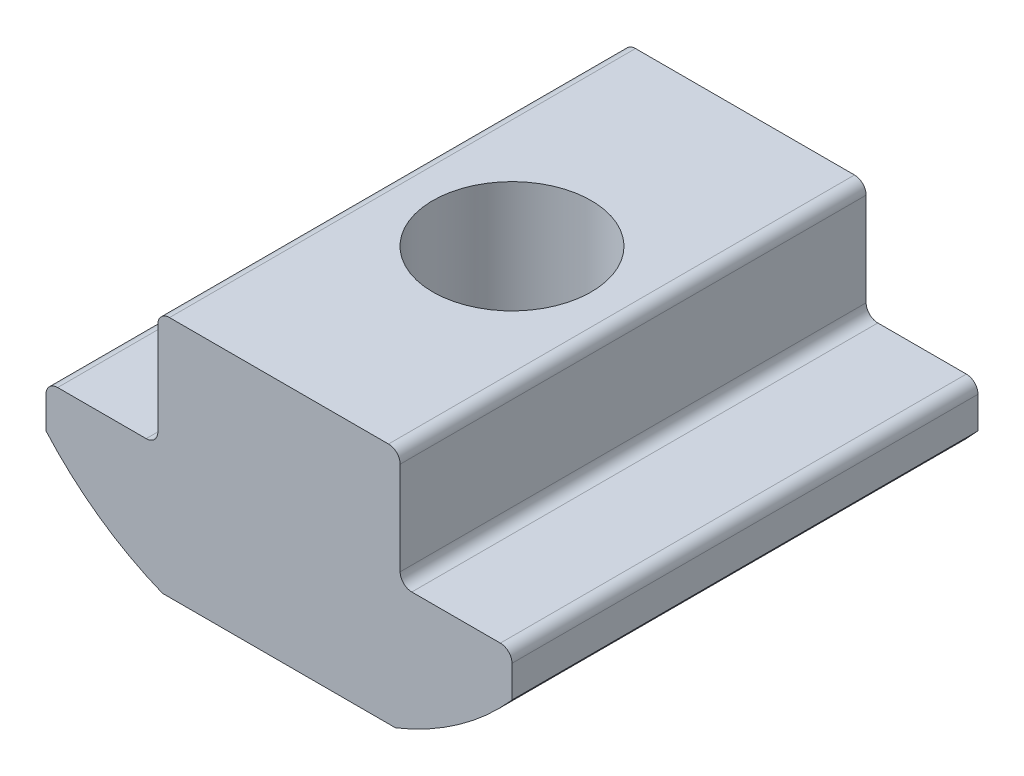
ISO-10303-21;
HEADER;
FILE_DESCRIPTION(('STEP AP214'),'2;1');
FILE_NAME('part.step','',(''),(''),'','','');
FILE_SCHEMA(('AUTOMOTIVE_DESIGN { 1 0 10303 214 1 1 1 1 }'));
ENDSEC;
DATA;
#1=APPLICATION_CONTEXT('core data for automotive mechanical design processes');
#2=APPLICATION_PROTOCOL_DEFINITION('international standard','automotive_design',2000,#1);
#3=PRODUCT_CONTEXT('',#1,'mechanical');
#4=PRODUCT('Part','Part','',(#3));
#5=PRODUCT_RELATED_PRODUCT_CATEGORY('part','',(#4));
#6=PRODUCT_DEFINITION_FORMATION('','',#4);
#7=PRODUCT_DEFINITION_CONTEXT('part definition',#1,'design');
#8=PRODUCT_DEFINITION('design','',#6,#7);
#9=PRODUCT_DEFINITION_SHAPE('','',#8);
#10=(LENGTH_UNIT() NAMED_UNIT(*) SI_UNIT(.MILLI.,.METRE.));
#11=(NAMED_UNIT(*) PLANE_ANGLE_UNIT() SI_UNIT($,.RADIAN.));
#12=(NAMED_UNIT(*) SI_UNIT($,.STERADIAN.) SOLID_ANGLE_UNIT());
#13=UNCERTAINTY_MEASURE_WITH_UNIT(LENGTH_MEASURE(1.E-05),#10,'distance_accuracy_value','');
#14=(GEOMETRIC_REPRESENTATION_CONTEXT(3) GLOBAL_UNCERTAINTY_ASSIGNED_CONTEXT((#13)) GLOBAL_UNIT_ASSIGNED_CONTEXT((#10,
#11,#12)) REPRESENTATION_CONTEXT('',''));
#15=CARTESIAN_POINT('',(0.,0.,0.));
#16=DIRECTION('',(0.,0.,1.));
#17=DIRECTION('',(1.,0.,0.));
#18=AXIS2_PLACEMENT_3D('',#15,#16,#17);
#19=CARTESIAN_POINT('',(-0.0580530387624094,12.2889853988804,10.));
#20=DIRECTION('',(0.,0.,-1.));
#21=DIRECTION('',(-1.,0.,0.));
#22=AXIS2_PLACEMENT_3D('',#19,#20,#21);
#23=CYLINDRICAL_SURFACE('',#22,13.2454521214485);
#24=CARTESIAN_POINT('',(-0.0580530387624094,12.2889853988804,-10.));
#25=DIRECTION('',(0.,0.,1.));
#26=DIRECTION('',(1.,0.,0.));
#27=AXIS2_PLACEMENT_3D('',#24,#25,#26);
#28=CIRCLE('',#27,13.2454521214485);
#29=CARTESIAN_POINT('',(-10.0000000000005,3.53686036997942,-10.));
#30=VERTEX_POINT('',#29);
#31=CARTESIAN_POINT('',(-5.,0.,-10.));
#32=VERTEX_POINT('',#31);
#33=EDGE_CURVE('E183',#30,#32,#28,.T.);
#34=ORIENTED_EDGE('',*,*,#33,.T.);
#35=DIRECTION('',(0.,0.,-1.));
#36=VECTOR('',#35,1.);
#37=CARTESIAN_POINT('',(-5.,0.,10.));
#38=LINE('',#37,#36);
#39=CARTESIAN_POINT('',(-5.,0.,10.));
#40=VERTEX_POINT('',#39);
#41=EDGE_CURVE('E11',#40,#32,#38,.T.);
#42=ORIENTED_EDGE('',*,*,#41,.F.);
#43=CARTESIAN_POINT('',(-0.0580530387624094,12.2889853988804,10.));
#44=DIRECTION('',(0.,0.,1.));
#45=DIRECTION('',(1.,0.,0.));
#46=AXIS2_PLACEMENT_3D('',#43,#44,#45);
#47=CIRCLE('',#46,13.2454521214485);
#48=CARTESIAN_POINT('',(-10.0000000000005,3.53686036997942,10.));
#49=VERTEX_POINT('',#48);
#50=EDGE_CURVE('E214',#49,#40,#47,.T.);
#51=ORIENTED_EDGE('',*,*,#50,.F.);
#52=DIRECTION('',(0.,0.,-1.));
#53=VECTOR('',#52,1.);
#54=CARTESIAN_POINT('',(-10.0000000000005,3.53686036997942,10.));
#55=LINE('',#54,#53);
#56=EDGE_CURVE('E179',#49,#30,#55,.T.);
#57=ORIENTED_EDGE('',*,*,#56,.T.);
#58=EDGE_LOOP('',(#34,#42,#51,#57));
#59=FACE_BOUND('',#58,.T.);
#60=ADVANCED_FACE('F39',(#59),#23,.T.);
#61=CARTESIAN_POINT('',(-5.,0.,10.));
#62=DIRECTION('',(0.,1.,0.));
#63=DIRECTION('',(0.,0.,1.));
#64=AXIS2_PLACEMENT_3D('',#61,#62,#63);
#65=PLANE('',#64);
#66=CARTESIAN_POINT('',(0.,0.,0.));
#67=DIRECTION('',(0.,1.,0.));
#68=DIRECTION('',(0.,0.,1.));
#69=AXIS2_PLACEMENT_3D('',#66,#67,#68);
#70=CIRCLE('',#69,3.39999999999999);
#71=CARTESIAN_POINT('',(0.,0.,3.39999999999999));
#72=VERTEX_POINT('',#71);
#73=EDGE_CURVE('E187',#72,#72,#70,.T.);
#74=ORIENTED_EDGE('',*,*,#73,.T.);
#75=EDGE_LOOP('',(#74));
#76=FACE_BOUND('',#75,.T.);
#77=DIRECTION('',(1.,0.,0.));
#78=VECTOR('',#77,1.);
#79=CARTESIAN_POINT('',(-5.,0.,-10.));
#80=LINE('',#79,#78);
#81=CARTESIAN_POINT('',(5.,0.,-10.));
#82=VERTEX_POINT('',#81);
#83=EDGE_CURVE('E186',#32,#82,#80,.T.);
#84=ORIENTED_EDGE('',*,*,#83,.T.);
#85=DIRECTION('',(0.,0.,-1.));
#86=VECTOR('',#85,1.);
#87=CARTESIAN_POINT('',(5.,0.,10.));
#88=LINE('',#87,#86);
#89=CARTESIAN_POINT('',(5.,0.,10.));
#90=VERTEX_POINT('',#89);
#91=EDGE_CURVE('E47',#90,#82,#88,.T.);
#92=ORIENTED_EDGE('',*,*,#91,.F.);
#93=DIRECTION('',(1.,0.,0.));
#94=VECTOR('',#93,1.);
#95=CARTESIAN_POINT('',(-5.,0.,10.));
#96=LINE('',#95,#94);
#97=EDGE_CURVE('E122',#40,#90,#96,.T.);
#98=ORIENTED_EDGE('',*,*,#97,.F.);
#99=ORIENTED_EDGE('',*,*,#41,.T.);
#100=EDGE_LOOP('',(#84,#92,#98,#99));
#101=FACE_BOUND('',#100,.T.);
#102=ADVANCED_FACE('F312',(#76,#101),#65,.F.);
#103=CARTESIAN_POINT('',(0.0580530387624094,12.2889853988804,10.));
#104=DIRECTION('',(0.,0.,-1.));
#105=DIRECTION('',(-1.,0.,0.));
#106=AXIS2_PLACEMENT_3D('',#103,#104,#105);
#107=CYLINDRICAL_SURFACE('',#106,13.2454521214484);
#108=CARTESIAN_POINT('',(0.0580530387624094,12.2889853988804,-10.));
#109=DIRECTION('',(0.,0.,1.));
#110=DIRECTION('',(1.,0.,0.));
#111=AXIS2_PLACEMENT_3D('',#108,#109,#110);
#112=CIRCLE('',#111,13.2454521214484);
#113=CARTESIAN_POINT('',(9.99999999999995,3.536860369979,-10.));
#114=VERTEX_POINT('',#113);
#115=EDGE_CURVE('E189',#82,#114,#112,.T.);
#116=ORIENTED_EDGE('',*,*,#115,.T.);
#117=DIRECTION('',(0.,0.,-1.));
#118=VECTOR('',#117,1.);
#119=CARTESIAN_POINT('',(9.99999999999995,3.536860369979,10.));
#120=LINE('',#119,#118);
#121=CARTESIAN_POINT('',(9.99999999999995,3.536860369979,10.));
#122=VERTEX_POINT('',#121);
#123=EDGE_CURVE('E245',#122,#114,#120,.T.);
#124=ORIENTED_EDGE('',*,*,#123,.F.);
#125=CARTESIAN_POINT('',(0.0580530387624094,12.2889853988804,10.));
#126=DIRECTION('',(0.,0.,1.));
#127=DIRECTION('',(1.,0.,0.));
#128=AXIS2_PLACEMENT_3D('',#125,#126,#127);
#129=CIRCLE('',#128,13.2454521214484);
#130=EDGE_CURVE('E253',#90,#122,#129,.T.);
#131=ORIENTED_EDGE('',*,*,#130,.F.);
#132=ORIENTED_EDGE('',*,*,#91,.T.);
#133=EDGE_LOOP('',(#116,#124,#131,#132));
#134=FACE_BOUND('',#133,.T.);
#135=ADVANCED_FACE('F251',(#134),#107,.T.);
#136=CARTESIAN_POINT('',(10.,4.90000000000009,10.));
#137=DIRECTION('',(-1.,0.,0.));
#138=DIRECTION('',(0.,0.,1.));
#139=AXIS2_PLACEMENT_3D('',#136,#137,#138);
#140=PLANE('',#139);
#141=DIRECTION('',(0.,1.,0.));
#142=VECTOR('',#141,1.);
#143=CARTESIAN_POINT('',(10.,4.90000000000009,-10.));
#144=LINE('',#143,#142);
#145=CARTESIAN_POINT('',(10.,4.90000000000009,-10.));
#146=VERTEX_POINT('',#145);
#147=EDGE_CURVE('E191',#114,#146,#144,.T.);
#148=ORIENTED_EDGE('',*,*,#147,.T.);
#149=DIRECTION('',(0.,0.,-1.));
#150=VECTOR('',#149,1.);
#151=CARTESIAN_POINT('',(10.,4.90000000000009,10.));
#152=LINE('',#151,#150);
#153=CARTESIAN_POINT('',(10.,4.90000000000009,10.));
#154=VERTEX_POINT('',#153);
#155=EDGE_CURVE('E242',#154,#146,#152,.T.);
#156=ORIENTED_EDGE('',*,*,#155,.F.);
#157=DIRECTION('',(0.,1.,0.));
#158=VECTOR('',#157,1.);
#159=CARTESIAN_POINT('',(10.,4.90000000000009,10.));
#160=LINE('',#159,#158);
#161=EDGE_CURVE('E271',#122,#154,#160,.T.);
#162=ORIENTED_EDGE('',*,*,#161,.F.);
#163=ORIENTED_EDGE('',*,*,#123,.T.);
#164=EDGE_LOOP('',(#148,#156,#162,#163));
#165=FACE_BOUND('',#164,.T.);
#166=ADVANCED_FACE('F262',(#165),#140,.F.);
#167=CARTESIAN_POINT('',(9.5,4.90000000000009,10.));
#168=DIRECTION('',(0.,0.,-1.));
#169=DIRECTION('',(-1.,0.,0.));
#170=AXIS2_PLACEMENT_3D('',#167,#168,#169);
#171=CYLINDRICAL_SURFACE('',#170,0.5);
#172=CARTESIAN_POINT('',(9.5,4.90000000000009,-10.));
#173=DIRECTION('',(0.,0.,1.));
#174=DIRECTION('',(1.,0.,0.));
#175=AXIS2_PLACEMENT_3D('',#172,#173,#174);
#176=CIRCLE('',#175,0.5);
#177=CARTESIAN_POINT('',(9.5,5.40000000000009,-10.));
#178=VERTEX_POINT('',#177);
#179=EDGE_CURVE('E193',#146,#178,#176,.T.);
#180=ORIENTED_EDGE('',*,*,#179,.T.);
#181=DIRECTION('',(0.,0.,-1.));
#182=VECTOR('',#181,1.);
#183=CARTESIAN_POINT('',(9.5,5.40000000000009,10.));
#184=LINE('',#183,#182);
#185=CARTESIAN_POINT('',(9.5,5.40000000000009,10.));
#186=VERTEX_POINT('',#185);
#187=EDGE_CURVE('E239',#186,#178,#184,.T.);
#188=ORIENTED_EDGE('',*,*,#187,.F.);
#189=CARTESIAN_POINT('',(9.5,4.90000000000009,10.));
#190=DIRECTION('',(0.,0.,1.));
#191=DIRECTION('',(1.,0.,0.));
#192=AXIS2_PLACEMENT_3D('',#189,#190,#191);
#193=CIRCLE('',#192,0.5);
#194=EDGE_CURVE('E268',#154,#186,#193,.T.);
#195=ORIENTED_EDGE('',*,*,#194,.F.);
#196=ORIENTED_EDGE('',*,*,#155,.T.);
#197=EDGE_LOOP('',(#180,#188,#195,#196));
#198=FACE_BOUND('',#197,.T.);
#199=ADVANCED_FACE('F266',(#198),#171,.T.);
#200=CARTESIAN_POINT('',(5.69999999999982,5.40000000000009,10.));
#201=DIRECTION('',(0.,-1.,0.));
#202=DIRECTION('',(0.,0.,-1.));
#203=AXIS2_PLACEMENT_3D('',#200,#201,#202);
#204=PLANE('',#203);
#205=DIRECTION('',(-1.,0.,0.));
#206=VECTOR('',#205,1.);
#207=CARTESIAN_POINT('',(5.69999999999982,5.40000000000009,-10.));
#208=LINE('',#207,#206);
#209=CARTESIAN_POINT('',(5.69999999999982,5.40000000000009,-10.));
#210=VERTEX_POINT('',#209);
#211=EDGE_CURVE('E195',#178,#210,#208,.T.);
#212=ORIENTED_EDGE('',*,*,#211,.T.);
#213=DIRECTION('',(0.,0.,-1.));
#214=VECTOR('',#213,1.);
#215=CARTESIAN_POINT('',(5.69999999999982,5.40000000000009,10.));
#216=LINE('',#215,#214);
#217=CARTESIAN_POINT('',(5.69999999999982,5.40000000000009,10.));
#218=VERTEX_POINT('',#217);
#219=EDGE_CURVE('E236',#218,#210,#216,.T.);
#220=ORIENTED_EDGE('',*,*,#219,.F.);
#221=DIRECTION('',(-1.,0.,0.));
#222=VECTOR('',#221,1.);
#223=CARTESIAN_POINT('',(5.69999999999982,5.40000000000009,10.));
#224=LINE('',#223,#222);
#225=EDGE_CURVE('E270',#186,#218,#224,.T.);
#226=ORIENTED_EDGE('',*,*,#225,.F.);
#227=ORIENTED_EDGE('',*,*,#187,.T.);
#228=EDGE_LOOP('',(#212,#220,#226,#227));
#229=FACE_BOUND('',#228,.T.);
#230=ADVANCED_FACE('F327',(#229),#204,.F.);
#231=CARTESIAN_POINT('',(5.69999999999982,5.90000000000009,10.));
#232=DIRECTION('',(0.,0.,-1.));
#233=DIRECTION('',(-1.,0.,0.));
#234=AXIS2_PLACEMENT_3D('',#231,#232,#233);
#235=CYLINDRICAL_SURFACE('',#234,0.5);
#236=CARTESIAN_POINT('',(5.69999999999982,5.90000000000009,-10.));
#237=DIRECTION('',(0.,0.,-1.));
#238=DIRECTION('',(1.,0.,0.));
#239=AXIS2_PLACEMENT_3D('',#236,#237,#238);
#240=CIRCLE('',#239,0.5);
#241=CARTESIAN_POINT('',(5.19999999999982,5.90000000000009,-10.));
#242=VERTEX_POINT('',#241);
#243=EDGE_CURVE('E197',#210,#242,#240,.T.);
#244=ORIENTED_EDGE('',*,*,#243,.T.);
#245=DIRECTION('',(0.,0.,-1.));
#246=VECTOR('',#245,1.);
#247=CARTESIAN_POINT('',(5.19999999999982,5.90000000000009,10.));
#248=LINE('',#247,#246);
#249=CARTESIAN_POINT('',(5.19999999999982,5.90000000000009,10.));
#250=VERTEX_POINT('',#249);
#251=EDGE_CURVE('E233',#250,#242,#248,.T.);
#252=ORIENTED_EDGE('',*,*,#251,.F.);
#253=CARTESIAN_POINT('',(5.69999999999982,5.90000000000009,10.));
#254=DIRECTION('',(0.,0.,-1.));
#255=DIRECTION('',(1.,0.,0.));
#256=AXIS2_PLACEMENT_3D('',#253,#254,#255);
#257=CIRCLE('',#256,0.5);
#258=EDGE_CURVE('E273',#218,#250,#257,.T.);
#259=ORIENTED_EDGE('',*,*,#258,.F.);
#260=ORIENTED_EDGE('',*,*,#219,.T.);
#261=EDGE_LOOP('',(#244,#252,#259,#260));
#262=FACE_BOUND('',#261,.T.);
#263=ADVANCED_FACE('F330',(#262),#235,.F.);
#264=CARTESIAN_POINT('',(5.20000000000027,9.90000000000009,10.));
#265=DIRECTION('',(-1.,1.13624387676481E-13,0.));
#266=DIRECTION('',(-1.13624387676481E-13,-1.,0.));
#267=AXIS2_PLACEMENT_3D('',#264,#265,#266);
#268=PLANE('',#267);
#269=DIRECTION('',(1.13624387676481E-13,1.,0.));
#270=VECTOR('',#269,1.);
#271=CARTESIAN_POINT('',(5.20000000000027,9.90000000000009,-10.));
#272=LINE('',#271,#270);
#273=CARTESIAN_POINT('',(5.20000000000027,9.90000000000009,-10.));
#274=VERTEX_POINT('',#273);
#275=EDGE_CURVE('E199',#242,#274,#272,.T.);
#276=ORIENTED_EDGE('',*,*,#275,.T.);
#277=DIRECTION('',(0.,0.,-1.));
#278=VECTOR('',#277,1.);
#279=CARTESIAN_POINT('',(5.20000000000027,9.90000000000009,10.));
#280=LINE('',#279,#278);
#281=CARTESIAN_POINT('',(5.20000000000027,9.90000000000009,10.));
#282=VERTEX_POINT('',#281);
#283=EDGE_CURVE('E230',#282,#274,#280,.T.);
#284=ORIENTED_EDGE('',*,*,#283,.F.);
#285=DIRECTION('',(1.13624387676481E-13,1.,0.));
#286=VECTOR('',#285,1.);
#287=CARTESIAN_POINT('',(5.20000000000027,9.90000000000009,10.));
#288=LINE('',#287,#286);
#289=EDGE_CURVE('E279',#250,#282,#288,.T.);
#290=ORIENTED_EDGE('',*,*,#289,.F.);
#291=ORIENTED_EDGE('',*,*,#251,.T.);
#292=EDGE_LOOP('',(#276,#284,#290,#291));
#293=FACE_BOUND('',#292,.T.);
#294=ADVANCED_FACE('F334',(#293),#268,.F.);
#295=CARTESIAN_POINT('',(4.70000000000027,9.90000000000009,10.));
#296=DIRECTION('',(0.,0.,-1.));
#297=DIRECTION('',(-1.,0.,0.));
#298=AXIS2_PLACEMENT_3D('',#295,#296,#297);
#299=CYLINDRICAL_SURFACE('',#298,0.5);
#300=CARTESIAN_POINT('',(4.70000000000027,9.90000000000009,-10.));
#301=DIRECTION('',(0.,0.,1.));
#302=DIRECTION('',(1.,0.,0.));
#303=AXIS2_PLACEMENT_3D('',#300,#301,#302);
#304=CIRCLE('',#303,0.5);
#305=CARTESIAN_POINT('',(4.70000000000027,10.4000000000001,-10.));
#306=VERTEX_POINT('',#305);
#307=EDGE_CURVE('E201',#274,#306,#304,.T.);
#308=ORIENTED_EDGE('',*,*,#307,.T.);
#309=DIRECTION('',(0.,0.,-1.));
#310=VECTOR('',#309,1.);
#311=CARTESIAN_POINT('',(4.70000000000027,10.4000000000001,10.));
#312=LINE('',#311,#310);
#313=CARTESIAN_POINT('',(4.70000000000027,10.4000000000001,10.));
#314=VERTEX_POINT('',#313);
#315=EDGE_CURVE('E227',#314,#306,#312,.T.);
#316=ORIENTED_EDGE('',*,*,#315,.F.);
#317=CARTESIAN_POINT('',(4.70000000000027,9.90000000000009,10.));
#318=DIRECTION('',(0.,0.,1.));
#319=DIRECTION('',(1.,0.,0.));
#320=AXIS2_PLACEMENT_3D('',#317,#318,#319);
#321=CIRCLE('',#320,0.5);
#322=EDGE_CURVE('E281',#282,#314,#321,.T.);
#323=ORIENTED_EDGE('',*,*,#322,.F.);
#324=ORIENTED_EDGE('',*,*,#283,.T.);
#325=EDGE_LOOP('',(#308,#316,#323,#324));
#326=FACE_BOUND('',#325,.T.);
#327=ADVANCED_FACE('F338',(#326),#299,.T.);
#328=CARTESIAN_POINT('',(-4.69999999999982,10.4000000000001,10.));
#329=DIRECTION('',(0.,-1.,0.));
#330=DIRECTION('',(0.,0.,-1.));
#331=AXIS2_PLACEMENT_3D('',#328,#329,#330);
#332=PLANE('',#331);
#333=CARTESIAN_POINT('',(0.,10.4000000000001,0.));
#334=DIRECTION('',(0.,1.,0.));
#335=DIRECTION('',(0.,0.,1.));
#336=AXIS2_PLACEMENT_3D('',#333,#334,#335);
#337=CIRCLE('',#336,3.39999999999999);
#338=CARTESIAN_POINT('',(0.,10.4000000000001,3.39999999999999));
#339=VERTEX_POINT('',#338);
#340=EDGE_CURVE('E414',#339,#339,#337,.T.);
#341=ORIENTED_EDGE('',*,*,#340,.F.);
#342=EDGE_LOOP('',(#341));
#343=FACE_BOUND('',#342,.T.);
#344=DIRECTION('',(-1.,0.,0.));
#345=VECTOR('',#344,1.);
#346=CARTESIAN_POINT('',(-4.69999999999982,10.4000000000001,-10.));
#347=LINE('',#346,#345);
#348=CARTESIAN_POINT('',(-4.69999999999982,10.4000000000001,-10.));
#349=VERTEX_POINT('',#348);
#350=EDGE_CURVE('E203',#306,#349,#347,.T.);
#351=ORIENTED_EDGE('',*,*,#350,.T.);
#352=DIRECTION('',(0.,0.,-1.));
#353=VECTOR('',#352,1.);
#354=CARTESIAN_POINT('',(-4.69999999999982,10.4000000000001,10.));
#355=LINE('',#354,#353);
#356=CARTESIAN_POINT('',(-4.69999999999982,10.4000000000001,10.));
#357=VERTEX_POINT('',#356);
#358=EDGE_CURVE('E224',#357,#349,#355,.T.);
#359=ORIENTED_EDGE('',*,*,#358,.F.);
#360=DIRECTION('',(-1.,0.,0.));
#361=VECTOR('',#360,1.);
#362=CARTESIAN_POINT('',(-4.69999999999982,10.4000000000001,10.));
#363=LINE('',#362,#361);
#364=EDGE_CURVE('E283',#314,#357,#363,.T.);
#365=ORIENTED_EDGE('',*,*,#364,.F.);
#366=ORIENTED_EDGE('',*,*,#315,.T.);
#367=EDGE_LOOP('',(#351,#359,#365,#366));
#368=FACE_BOUND('',#367,.T.);
#369=ADVANCED_FACE('F342',(#343,#368),#332,.F.);
#370=CARTESIAN_POINT('',(-4.70000000000027,9.90000000000009,10.));
#371=DIRECTION('',(0.,0.,-1.));
#372=DIRECTION('',(-1.,0.,0.));
#373=AXIS2_PLACEMENT_3D('',#370,#371,#372);
#374=CYLINDRICAL_SURFACE('',#373,0.499999999999773);
#375=CARTESIAN_POINT('',(-4.70000000000027,9.90000000000009,-10.));
#376=DIRECTION('',(0.,0.,1.));
#377=DIRECTION('',(1.,0.,0.));
#378=AXIS2_PLACEMENT_3D('',#375,#376,#377);
#379=CIRCLE('',#378,0.499999999999773);
#380=CARTESIAN_POINT('',(-5.20000000000005,9.90000000000009,-10.));
#381=VERTEX_POINT('',#380);
#382=EDGE_CURVE('E205',#349,#381,#379,.T.);
#383=ORIENTED_EDGE('',*,*,#382,.T.);
#384=DIRECTION('',(0.,0.,-1.));
#385=VECTOR('',#384,1.);
#386=CARTESIAN_POINT('',(-5.20000000000005,9.90000000000009,10.));
#387=LINE('',#386,#385);
#388=CARTESIAN_POINT('',(-5.20000000000005,9.90000000000009,10.));
#389=VERTEX_POINT('',#388);
#390=EDGE_CURVE('E221',#389,#381,#387,.T.);
#391=ORIENTED_EDGE('',*,*,#390,.F.);
#392=CARTESIAN_POINT('',(-4.70000000000027,9.90000000000009,10.));
#393=DIRECTION('',(0.,0.,1.));
#394=DIRECTION('',(1.,0.,0.));
#395=AXIS2_PLACEMENT_3D('',#392,#393,#394);
#396=CIRCLE('',#395,0.499999999999773);
#397=EDGE_CURVE('E285',#357,#389,#396,.T.);
#398=ORIENTED_EDGE('',*,*,#397,.F.);
#399=ORIENTED_EDGE('',*,*,#358,.T.);
#400=EDGE_LOOP('',(#383,#391,#398,#399));
#401=FACE_BOUND('',#400,.T.);
#402=ADVANCED_FACE('F346',(#401),#374,.T.);
#403=CARTESIAN_POINT('',(-5.19999999999982,9.90000000000009,10.));
#404=DIRECTION('',(1.,0.,0.));
#405=DIRECTION('',(0.,0.,-1.));
#406=AXIS2_PLACEMENT_3D('',#403,#404,#405);
#407=PLANE('',#406);
#408=DIRECTION('',(0.,-1.,0.));
#409=VECTOR('',#408,1.);
#410=CARTESIAN_POINT('',(-5.19999999999982,9.90000000000009,-10.));
#411=LINE('',#410,#409);
#412=CARTESIAN_POINT('',(-5.19999999999982,5.90000000000009,-10.));
#413=VERTEX_POINT('',#412);
#414=EDGE_CURVE('E207',#381,#413,#411,.T.);
#415=ORIENTED_EDGE('',*,*,#414,.T.);
#416=DIRECTION('',(0.,0.,-1.));
#417=VECTOR('',#416,1.);
#418=CARTESIAN_POINT('',(-5.19999999999982,5.90000000000009,10.));
#419=LINE('',#418,#417);
#420=CARTESIAN_POINT('',(-5.19999999999982,5.90000000000009,10.));
#421=VERTEX_POINT('',#420);
#422=EDGE_CURVE('E218',#421,#413,#419,.T.);
#423=ORIENTED_EDGE('',*,*,#422,.F.);
#424=DIRECTION('',(0.,-1.,0.));
#425=VECTOR('',#424,1.);
#426=CARTESIAN_POINT('',(-5.19999999999982,9.90000000000009,10.));
#427=LINE('',#426,#425);
#428=EDGE_CURVE('E287',#389,#421,#427,.T.);
#429=ORIENTED_EDGE('',*,*,#428,.F.);
#430=ORIENTED_EDGE('',*,*,#390,.T.);
#431=EDGE_LOOP('',(#415,#423,#429,#430));
#432=FACE_BOUND('',#431,.T.);
#433=ADVANCED_FACE('F293',(#432),#407,.F.);
#434=CARTESIAN_POINT('',(-5.69999999999982,5.90000000000009,10.));
#435=DIRECTION('',(0.,0.,-1.));
#436=DIRECTION('',(-1.,0.,0.));
#437=AXIS2_PLACEMENT_3D('',#434,#435,#436);
#438=CYLINDRICAL_SURFACE('',#437,0.5);
#439=CARTESIAN_POINT('',(-5.69999999999982,5.90000000000009,-10.));
#440=DIRECTION('',(0.,0.,-1.));
#441=DIRECTION('',(1.,0.,0.));
#442=AXIS2_PLACEMENT_3D('',#439,#440,#441);
#443=CIRCLE('',#442,0.5);
#444=CARTESIAN_POINT('',(-5.69999999999982,5.40000000000009,-10.));
#445=VERTEX_POINT('',#444);
#446=EDGE_CURVE('E209',#413,#445,#443,.T.);
#447=ORIENTED_EDGE('',*,*,#446,.T.);
#448=DIRECTION('',(0.,0.,-1.));
#449=VECTOR('',#448,1.);
#450=CARTESIAN_POINT('',(-5.69999999999982,5.40000000000009,10.));
#451=LINE('',#450,#449);
#452=CARTESIAN_POINT('',(-5.69999999999982,5.40000000000009,10.));
#453=VERTEX_POINT('',#452);
#454=EDGE_CURVE('E174',#453,#445,#451,.T.);
#455=ORIENTED_EDGE('',*,*,#454,.F.);
#456=CARTESIAN_POINT('',(-5.69999999999982,5.90000000000009,10.));
#457=DIRECTION('',(0.,0.,-1.));
#458=DIRECTION('',(1.,0.,0.));
#459=AXIS2_PLACEMENT_3D('',#456,#457,#458);
#460=CIRCLE('',#459,0.5);
#461=EDGE_CURVE('E165',#421,#453,#460,.T.);
#462=ORIENTED_EDGE('',*,*,#461,.F.);
#463=ORIENTED_EDGE('',*,*,#422,.T.);
#464=EDGE_LOOP('',(#447,#455,#462,#463));
#465=FACE_BOUND('',#464,.T.);
#466=ADVANCED_FACE('F297',(#465),#438,.F.);
#467=CARTESIAN_POINT('',(-9.5,5.40000000000009,10.));
#468=DIRECTION('',(0.,-1.,0.));
#469=DIRECTION('',(0.,0.,-1.));
#470=AXIS2_PLACEMENT_3D('',#467,#468,#469);
#471=PLANE('',#470);
#472=DIRECTION('',(-1.,0.,0.));
#473=VECTOR('',#472,1.);
#474=CARTESIAN_POINT('',(-9.5,5.40000000000009,-10.));
#475=LINE('',#474,#473);
#476=CARTESIAN_POINT('',(-9.5,5.40000000000009,-10.));
#477=VERTEX_POINT('',#476);
#478=EDGE_CURVE('E173',#445,#477,#475,.T.);
#479=ORIENTED_EDGE('',*,*,#478,.T.);
#480=DIRECTION('',(0.,0.,-1.));
#481=VECTOR('',#480,1.);
#482=CARTESIAN_POINT('',(-9.5,5.40000000000009,10.));
#483=LINE('',#482,#481);
#484=CARTESIAN_POINT('',(-9.5,5.40000000000009,10.));
#485=VERTEX_POINT('',#484);
#486=EDGE_CURVE('E170',#485,#477,#483,.T.);
#487=ORIENTED_EDGE('',*,*,#486,.F.);
#488=DIRECTION('',(-1.,0.,0.));
#489=VECTOR('',#488,1.);
#490=CARTESIAN_POINT('',(-9.5,5.40000000000009,10.));
#491=LINE('',#490,#489);
#492=EDGE_CURVE('E159',#453,#485,#491,.T.);
#493=ORIENTED_EDGE('',*,*,#492,.F.);
#494=ORIENTED_EDGE('',*,*,#454,.T.);
#495=EDGE_LOOP('',(#479,#487,#493,#494));
#496=FACE_BOUND('',#495,.T.);
#497=ADVANCED_FACE('F171',(#496),#471,.F.);
#498=CARTESIAN_POINT('',(-9.50000000000045,4.90000000000009,10.));
#499=DIRECTION('',(0.,0.,-1.));
#500=DIRECTION('',(-1.,0.,0.));
#501=AXIS2_PLACEMENT_3D('',#498,#499,#500);
#502=CYLINDRICAL_SURFACE('',#501,0.499999999999773);
#503=CARTESIAN_POINT('',(-9.50000000000045,4.90000000000009,-10.));
#504=DIRECTION('',(0.,0.,1.));
#505=DIRECTION('',(1.,0.,0.));
#506=AXIS2_PLACEMENT_3D('',#503,#504,#505);
#507=CIRCLE('',#506,0.499999999999773);
#508=CARTESIAN_POINT('',(-10.0000000000002,4.90000000000009,-10.));
#509=VERTEX_POINT('',#508);
#510=EDGE_CURVE('E108',#477,#509,#507,.T.);
#511=ORIENTED_EDGE('',*,*,#510,.T.);
#512=DIRECTION('',(0.,0.,-1.));
#513=VECTOR('',#512,1.);
#514=CARTESIAN_POINT('',(-10.0000000000002,4.90000000000009,10.));
#515=LINE('',#514,#513);
#516=CARTESIAN_POINT('',(-10.0000000000002,4.90000000000009,10.));
#517=VERTEX_POINT('',#516);
#518=EDGE_CURVE('E175',#517,#509,#515,.T.);
#519=ORIENTED_EDGE('',*,*,#518,.F.);
#520=CARTESIAN_POINT('',(-9.50000000000045,4.90000000000009,10.));
#521=DIRECTION('',(0.,0.,1.));
#522=DIRECTION('',(1.,0.,0.));
#523=AXIS2_PLACEMENT_3D('',#520,#521,#522);
#524=CIRCLE('',#523,0.499999999999773);
#525=EDGE_CURVE('E163',#485,#517,#524,.T.);
#526=ORIENTED_EDGE('',*,*,#525,.F.);
#527=ORIENTED_EDGE('',*,*,#486,.T.);
#528=EDGE_LOOP('',(#511,#519,#526,#527));
#529=FACE_BOUND('',#528,.T.);
#530=ADVANCED_FACE('F177',(#529),#502,.T.);
#531=CARTESIAN_POINT('',(-10.,4.90000000000009,10.));
#532=DIRECTION('',(1.,-3.33419659069726E-13,0.));
#533=DIRECTION('',(3.33419659069726E-13,1.,0.));
#534=AXIS2_PLACEMENT_3D('',#531,#532,#533);
#535=PLANE('',#534);
#536=DIRECTION('',(-3.33419659069726E-13,-1.,0.));
#537=VECTOR('',#536,1.);
#538=CARTESIAN_POINT('',(-10.,4.90000000000009,-10.));
#539=LINE('',#538,#537);
#540=EDGE_CURVE('E114',#509,#30,#539,.T.);
#541=ORIENTED_EDGE('',*,*,#540,.T.);
#542=ORIENTED_EDGE('',*,*,#56,.F.);
#543=DIRECTION('',(-3.33419659069726E-13,-1.,0.));
#544=VECTOR('',#543,1.);
#545=CARTESIAN_POINT('',(-10.,4.90000000000009,10.));
#546=LINE('',#545,#544);
#547=EDGE_CURVE('E55',#517,#49,#546,.T.);
#548=ORIENTED_EDGE('',*,*,#547,.F.);
#549=ORIENTED_EDGE('',*,*,#518,.T.);
#550=EDGE_LOOP('',(#541,#542,#548,#549));
#551=FACE_BOUND('',#550,.T.);
#552=ADVANCED_FACE('F301',(#551),#535,.F.);
#553=CARTESIAN_POINT('',(-0.0580530387624094,12.2889853988804,10.));
#554=DIRECTION('',(0.,0.,1.));
#555=DIRECTION('',(1.,0.,0.));
#556=AXIS2_PLACEMENT_3D('',#553,#554,#555);
#557=PLANE('',#556);
#558=ORIENTED_EDGE('',*,*,#50,.T.);
#559=ORIENTED_EDGE('',*,*,#97,.T.);
#560=ORIENTED_EDGE('',*,*,#130,.T.);
#561=ORIENTED_EDGE('',*,*,#161,.T.);
#562=ORIENTED_EDGE('',*,*,#194,.T.);
#563=ORIENTED_EDGE('',*,*,#225,.T.);
#564=ORIENTED_EDGE('',*,*,#258,.T.);
#565=ORIENTED_EDGE('',*,*,#289,.T.);
#566=ORIENTED_EDGE('',*,*,#322,.T.);
#567=ORIENTED_EDGE('',*,*,#364,.T.);
#568=ORIENTED_EDGE('',*,*,#397,.T.);
#569=ORIENTED_EDGE('',*,*,#428,.T.);
#570=ORIENTED_EDGE('',*,*,#461,.T.);
#571=ORIENTED_EDGE('',*,*,#492,.T.);
#572=ORIENTED_EDGE('',*,*,#525,.T.);
#573=ORIENTED_EDGE('',*,*,#547,.T.);
#574=EDGE_LOOP('',(#558,#559,#560,#561,#562,#563,#564,#565,#566,#567,#568,#569,#570,#571,#572,#573));
#575=FACE_BOUND('',#574,.T.);
#576=ADVANCED_FACE('F161',(#575),#557,.T.);
#577=CARTESIAN_POINT('',(-0.0580530387624094,12.2889853988804,-10.));
#578=DIRECTION('',(0.,0.,1.));
#579=DIRECTION('',(1.,0.,0.));
#580=AXIS2_PLACEMENT_3D('',#577,#578,#579);
#581=PLANE('',#580);
#582=ORIENTED_EDGE('',*,*,#33,.F.);
#583=ORIENTED_EDGE('',*,*,#540,.F.);
#584=ORIENTED_EDGE('',*,*,#510,.F.);
#585=ORIENTED_EDGE('',*,*,#478,.F.);
#586=ORIENTED_EDGE('',*,*,#446,.F.);
#587=ORIENTED_EDGE('',*,*,#414,.F.);
#588=ORIENTED_EDGE('',*,*,#382,.F.);
#589=ORIENTED_EDGE('',*,*,#350,.F.);
#590=ORIENTED_EDGE('',*,*,#307,.F.);
#591=ORIENTED_EDGE('',*,*,#275,.F.);
#592=ORIENTED_EDGE('',*,*,#243,.F.);
#593=ORIENTED_EDGE('',*,*,#211,.F.);
#594=ORIENTED_EDGE('',*,*,#179,.F.);
#595=ORIENTED_EDGE('',*,*,#147,.F.);
#596=ORIENTED_EDGE('',*,*,#115,.F.);
#597=ORIENTED_EDGE('',*,*,#83,.F.);
#598=EDGE_LOOP('',(#582,#583,#584,#585,#586,#587,#588,#589,#590,#591,#592,#593,#594,#595,#596,#597));
#599=FACE_BOUND('',#598,.T.);
#600=ADVANCED_FACE('F257',(#599),#581,.F.);
#601=CARTESIAN_POINT('',(0.,10.4000000000001,0.));
#602=DIRECTION('',(0.,1.,0.));
#603=DIRECTION('',(0.,0.,1.));
#604=AXIS2_PLACEMENT_3D('',#601,#602,#603);
#605=CYLINDRICAL_SURFACE('',#604,3.39999999999999);
#606=ORIENTED_EDGE('',*,*,#340,.T.);
#607=EDGE_LOOP('',(#606));
#608=FACE_BOUND('',#607,.T.);
#609=ORIENTED_EDGE('',*,*,#73,.F.);
#610=EDGE_LOOP('',(#609));
#611=FACE_BOUND('',#610,.T.);
#612=ADVANCED_FACE('F382',(#608,#611),#605,.F.);
#613=CLOSED_SHELL('',(#60,#102,#135,#166,#199,#230,#263,#294,#327,#369,#402,#433,#466,#497,#530,
#552,#576,#600,#612));
#614=MANIFOLD_SOLID_BREP('B2',#613);
#615=ADVANCED_BREP_SHAPE_REPRESENTATION('',(#18,#614),#14);
#616=SHAPE_DEFINITION_REPRESENTATION(#9,#615);
ENDSEC;
END-ISO-10303-21;
